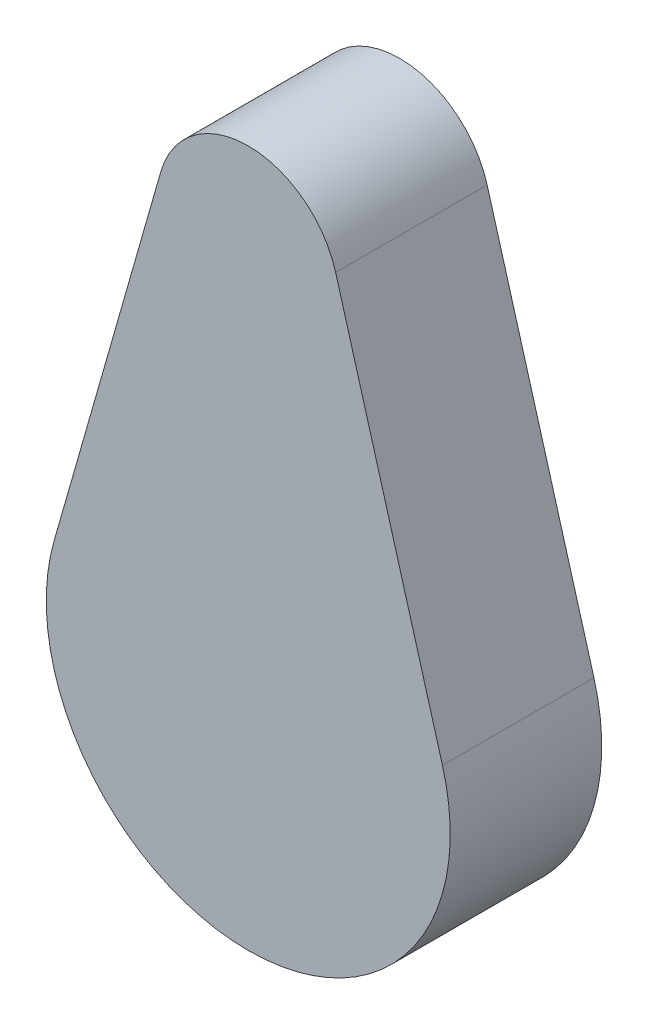
ISO-10303-21;
HEADER;
FILE_DESCRIPTION(('STEP AP214'),'2;1');
FILE_NAME('part.step','',(''),(''),'','','');
FILE_SCHEMA(('AUTOMOTIVE_DESIGN { 1 0 10303 214 1 1 1 1 }'));
ENDSEC;
DATA;
#1=APPLICATION_CONTEXT('core data for automotive mechanical design processes');
#2=APPLICATION_PROTOCOL_DEFINITION('international standard','automotive_design',2000,#1);
#3=PRODUCT_CONTEXT('',#1,'mechanical');
#4=PRODUCT('Part','Part','',(#3));
#5=PRODUCT_RELATED_PRODUCT_CATEGORY('part','',(#4));
#6=PRODUCT_DEFINITION_FORMATION('','',#4);
#7=PRODUCT_DEFINITION_CONTEXT('part definition',#1,'design');
#8=PRODUCT_DEFINITION('design','',#6,#7);
#9=PRODUCT_DEFINITION_SHAPE('','',#8);
#10=(LENGTH_UNIT() NAMED_UNIT(*) SI_UNIT(.MILLI.,.METRE.));
#11=(NAMED_UNIT(*) PLANE_ANGLE_UNIT() SI_UNIT($,.RADIAN.));
#12=(NAMED_UNIT(*) SI_UNIT($,.STERADIAN.) SOLID_ANGLE_UNIT());
#13=UNCERTAINTY_MEASURE_WITH_UNIT(LENGTH_MEASURE(1.E-05),#10,'distance_accuracy_value','');
#14=(GEOMETRIC_REPRESENTATION_CONTEXT(3) GLOBAL_UNCERTAINTY_ASSIGNED_CONTEXT((#13)) GLOBAL_UNIT_ASSIGNED_CONTEXT((#10,
#11,#12)) REPRESENTATION_CONTEXT('',''));
#15=CARTESIAN_POINT('',(0.,0.,0.));
#16=DIRECTION('',(0.,0.,1.));
#17=DIRECTION('',(1.,0.,0.));
#18=AXIS2_PLACEMENT_3D('',#15,#16,#17);
#19=CARTESIAN_POINT('',(0.,0.,15.));
#20=DIRECTION('',(0.,0.,-1.));
#21=DIRECTION('',(-1.,0.,0.));
#22=AXIS2_PLACEMENT_3D('',#19,#20,#21);
#23=CYLINDRICAL_SURFACE('',#22,18.);
#24=CARTESIAN_POINT('',(0.,0.,-15.));
#25=DIRECTION('',(0.,0.,1.));
#26=DIRECTION('',(1.,0.,0.));
#27=AXIS2_PLACEMENT_3D('',#24,#25,#26);
#28=CIRCLE('',#27,18.);
#29=CARTESIAN_POINT('',(17.3059960707265,4.95,-15.));
#30=VERTEX_POINT('',#29);
#31=CARTESIAN_POINT('',(-17.3059960707265,4.95,-15.));
#32=VERTEX_POINT('',#31);
#33=EDGE_CURVE('E116',#30,#32,#28,.T.);
#34=ORIENTED_EDGE('',*,*,#33,.T.);
#35=DIRECTION('',(0.,0.,-1.));
#36=VECTOR('',#35,1.);
#37=CARTESIAN_POINT('',(-17.3059960707265,4.95,15.));
#38=LINE('',#37,#36);
#39=CARTESIAN_POINT('',(-17.3059960707265,4.95,15.));
#40=VERTEX_POINT('',#39);
#41=EDGE_CURVE('E54',#40,#32,#38,.T.);
#42=ORIENTED_EDGE('',*,*,#41,.F.);
#43=CARTESIAN_POINT('',(0.,0.,15.));
#44=DIRECTION('',(0.,0.,1.));
#45=DIRECTION('',(1.,0.,0.));
#46=AXIS2_PLACEMENT_3D('',#43,#44,#45);
#47=CIRCLE('',#46,18.);
#48=CARTESIAN_POINT('',(17.3059960707265,4.95,15.));
#49=VERTEX_POINT('',#48);
#50=EDGE_CURVE('E98',#49,#40,#47,.T.);
#51=ORIENTED_EDGE('',*,*,#50,.F.);
#52=DIRECTION('',(0.,0.,-1.));
#53=VECTOR('',#52,1.);
#54=CARTESIAN_POINT('',(17.3059960707265,4.95,15.));
#55=LINE('',#54,#53);
#56=EDGE_CURVE('E112',#49,#30,#55,.T.);
#57=ORIENTED_EDGE('',*,*,#56,.T.);
#58=EDGE_LOOP('',(#34,#42,#51,#57));
#59=FACE_BOUND('',#58,.T.);
#60=ADVANCED_FACE('F45',(#59),#23,.T.);
#61=CARTESIAN_POINT('',(-17.3059960707265,4.95,15.));
#62=DIRECTION('',(0.961444226151471,-0.275,0.));
#63=DIRECTION('',(0.275,0.961444226151471,0.));
#64=AXIS2_PLACEMENT_3D('',#61,#62,#63);
#65=PLANE('',#64);
#66=DIRECTION('',(-0.275,-0.961444226151471,0.));
#67=VECTOR('',#66,1.);
#68=CARTESIAN_POINT('',(-17.3059960707265,4.95,-15.));
#69=LINE('',#68,#67);
#70=CARTESIAN_POINT('',(-38.4577690460588,-69.,-15.));
#71=VERTEX_POINT('',#70);
#72=EDGE_CURVE('E104',#32,#71,#69,.T.);
#73=ORIENTED_EDGE('',*,*,#72,.T.);
#74=DIRECTION('',(0.,0.,-1.));
#75=VECTOR('',#74,1.);
#76=CARTESIAN_POINT('',(-38.4577690460588,-69.,15.));
#77=LINE('',#76,#75);
#78=CARTESIAN_POINT('',(-38.4577690460588,-69.,15.));
#79=VERTEX_POINT('',#78);
#80=EDGE_CURVE('E102',#79,#71,#77,.T.);
#81=ORIENTED_EDGE('',*,*,#80,.F.);
#82=DIRECTION('',(-0.275,-0.961444226151471,0.));
#83=VECTOR('',#82,1.);
#84=CARTESIAN_POINT('',(-17.3059960707265,4.95,15.));
#85=LINE('',#84,#83);
#86=EDGE_CURVE('E93',#40,#79,#85,.T.);
#87=ORIENTED_EDGE('',*,*,#86,.F.);
#88=ORIENTED_EDGE('',*,*,#41,.T.);
#89=EDGE_LOOP('',(#73,#81,#87,#88));
#90=FACE_BOUND('',#89,.T.);
#91=ADVANCED_FACE('F103',(#90),#65,.F.);
#92=CARTESIAN_POINT('',(0.,-80.,15.));
#93=DIRECTION('',(0.,0.,-1.));
#94=DIRECTION('',(-1.,0.,0.));
#95=AXIS2_PLACEMENT_3D('',#92,#93,#94);
#96=CYLINDRICAL_SURFACE('',#95,40.);
#97=CARTESIAN_POINT('',(0.,-80.,-15.));
#98=DIRECTION('',(0.,0.,1.));
#99=DIRECTION('',(1.,0.,0.));
#100=AXIS2_PLACEMENT_3D('',#97,#98,#99);
#101=CIRCLE('',#100,40.);
#102=CARTESIAN_POINT('',(38.4577690460588,-69.,-15.));
#103=VERTEX_POINT('',#102);
#104=EDGE_CURVE('E79',#71,#103,#101,.T.);
#105=ORIENTED_EDGE('',*,*,#104,.T.);
#106=DIRECTION('',(0.,0.,-1.));
#107=VECTOR('',#106,1.);
#108=CARTESIAN_POINT('',(38.4577690460588,-69.,15.));
#109=LINE('',#108,#107);
#110=CARTESIAN_POINT('',(38.4577690460588,-69.,15.));
#111=VERTEX_POINT('',#110);
#112=EDGE_CURVE('E106',#111,#103,#109,.T.);
#113=ORIENTED_EDGE('',*,*,#112,.F.);
#114=CARTESIAN_POINT('',(0.,-80.,15.));
#115=DIRECTION('',(0.,0.,1.));
#116=DIRECTION('',(1.,0.,0.));
#117=AXIS2_PLACEMENT_3D('',#114,#115,#116);
#118=CIRCLE('',#117,40.);
#119=EDGE_CURVE('E96',#79,#111,#118,.T.);
#120=ORIENTED_EDGE('',*,*,#119,.F.);
#121=ORIENTED_EDGE('',*,*,#80,.T.);
#122=EDGE_LOOP('',(#105,#113,#120,#121));
#123=FACE_BOUND('',#122,.T.);
#124=ADVANCED_FACE('F108',(#123),#96,.T.);
#125=CARTESIAN_POINT('',(17.3059960707265,4.95,15.));
#126=DIRECTION('',(-0.961444226151471,-0.275,0.));
#127=DIRECTION('',(0.275,-0.961444226151471,0.));
#128=AXIS2_PLACEMENT_3D('',#125,#126,#127);
#129=PLANE('',#128);
#130=DIRECTION('',(-0.275,0.961444226151471,0.));
#131=VECTOR('',#130,1.);
#132=CARTESIAN_POINT('',(17.3059960707265,4.95,-15.));
#133=LINE('',#132,#131);
#134=EDGE_CURVE('E85',#103,#30,#133,.T.);
#135=ORIENTED_EDGE('',*,*,#134,.T.);
#136=ORIENTED_EDGE('',*,*,#56,.F.);
#137=DIRECTION('',(-0.275,0.961444226151471,0.));
#138=VECTOR('',#137,1.);
#139=CARTESIAN_POINT('',(17.3059960707265,4.95,15.));
#140=LINE('',#139,#138);
#141=EDGE_CURVE('E62',#111,#49,#140,.T.);
#142=ORIENTED_EDGE('',*,*,#141,.F.);
#143=ORIENTED_EDGE('',*,*,#112,.T.);
#144=EDGE_LOOP('',(#135,#136,#142,#143));
#145=FACE_BOUND('',#144,.T.);
#146=ADVANCED_FACE('F146',(#145),#129,.F.);
#147=CARTESIAN_POINT('',(0.,0.,15.));
#148=DIRECTION('',(0.,0.,1.));
#149=DIRECTION('',(1.,0.,0.));
#150=AXIS2_PLACEMENT_3D('',#147,#148,#149);
#151=PLANE('',#150);
#152=ORIENTED_EDGE('',*,*,#50,.T.);
#153=ORIENTED_EDGE('',*,*,#86,.T.);
#154=ORIENTED_EDGE('',*,*,#119,.T.);
#155=ORIENTED_EDGE('',*,*,#141,.T.);
#156=EDGE_LOOP('',(#152,#153,#154,#155));
#157=FACE_BOUND('',#156,.T.);
#158=ADVANCED_FACE('F94',(#157),#151,.T.);
#159=CARTESIAN_POINT('',(0.,0.,-15.));
#160=DIRECTION('',(0.,0.,1.));
#161=DIRECTION('',(1.,0.,0.));
#162=AXIS2_PLACEMENT_3D('',#159,#160,#161);
#163=PLANE('',#162);
#164=CARTESIAN_POINT('',(0.,-80.,-15.));
#165=DIRECTION('',(0.,0.,1.));
#166=DIRECTION('',(1.,0.,0.));
#167=AXIS2_PLACEMENT_3D('',#164,#165,#166);
#168=CIRCLE('',#167,12.);
#169=CARTESIAN_POINT('',(12.,-80.,-15.));
#170=VERTEX_POINT('',#169);
#171=EDGE_CURVE('E11',#170,#170,#168,.F.);
#172=ORIENTED_EDGE('',*,*,#171,.F.);
#173=EDGE_LOOP('',(#172));
#174=FACE_BOUND('',#173,.T.);
#175=ORIENTED_EDGE('',*,*,#33,.F.);
#176=ORIENTED_EDGE('',*,*,#134,.F.);
#177=ORIENTED_EDGE('',*,*,#104,.F.);
#178=ORIENTED_EDGE('',*,*,#72,.F.);
#179=EDGE_LOOP('',(#175,#176,#177,#178));
#180=FACE_BOUND('',#179,.T.);
#181=ADVANCED_FACE('F134',(#174,#180),#163,.F.);
#182=CARTESIAN_POINT('',(0.,-80.,-27.));
#183=DIRECTION('',(0.,0.,1.));
#184=DIRECTION('',(1.,0.,0.));
#185=AXIS2_PLACEMENT_3D('',#182,#183,#184);
#186=CYLINDRICAL_SURFACE('',#185,12.);
#187=CARTESIAN_POINT('',(0.,-80.,-27.));
#188=DIRECTION('',(0.,0.,-1.));
#189=DIRECTION('',(-1.,0.,0.));
#190=AXIS2_PLACEMENT_3D('',#187,#188,#189);
#191=CIRCLE('',#190,12.);
#192=CARTESIAN_POINT('',(-12.,-80.,-27.));
#193=VERTEX_POINT('',#192);
#194=EDGE_CURVE('E120',#193,#193,#191,.T.);
#195=ORIENTED_EDGE('',*,*,#194,.F.);
#196=EDGE_LOOP('',(#195));
#197=FACE_BOUND('',#196,.T.);
#198=ORIENTED_EDGE('',*,*,#171,.T.);
#199=EDGE_LOOP('',(#198));
#200=FACE_BOUND('',#199,.T.);
#201=ADVANCED_FACE('F136',(#197,#200),#186,.T.);
#202=CARTESIAN_POINT('',(0.,-80.,-27.));
#203=DIRECTION('',(0.,0.,-1.));
#204=DIRECTION('',(-1.,0.,0.));
#205=AXIS2_PLACEMENT_3D('',#202,#203,#204);
#206=PLANE('',#205);
#207=ORIENTED_EDGE('',*,*,#194,.T.);
#208=EDGE_LOOP('',(#207));
#209=FACE_BOUND('',#208,.T.);
#210=ADVANCED_FACE('F143',(#209),#206,.T.);
#211=CLOSED_SHELL('',(#60,#91,#124,#146,#158,#181,#201,#210));
#212=MANIFOLD_SOLID_BREP('B2',#211);
#213=ADVANCED_BREP_SHAPE_REPRESENTATION('',(#18,#212),#14);
#214=SHAPE_DEFINITION_REPRESENTATION(#9,#213);
ENDSEC;
END-ISO-10303-21;
